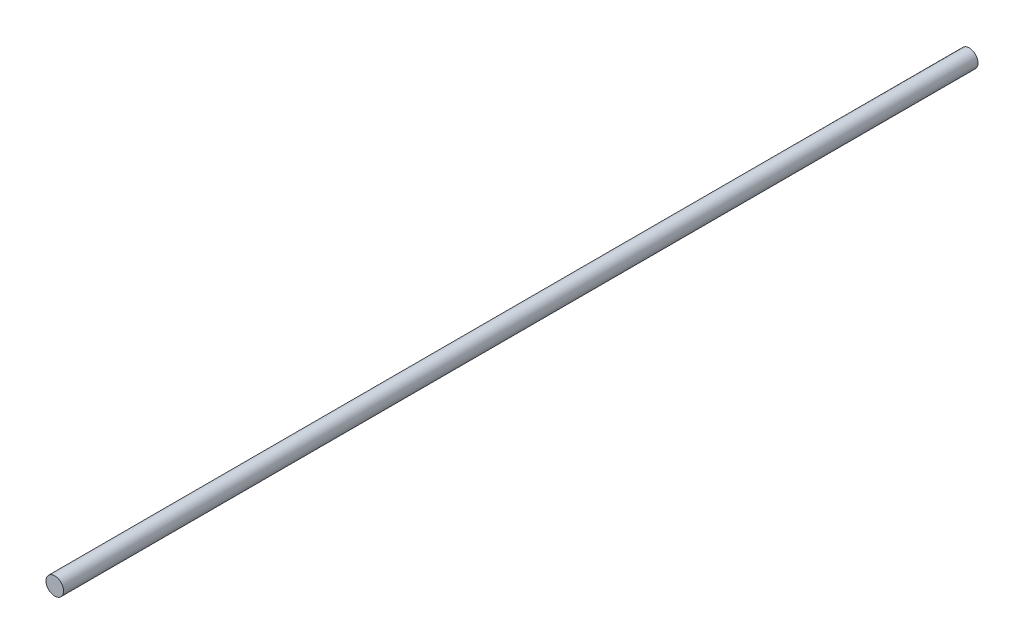
ISO-10303-21;
HEADER;
FILE_DESCRIPTION(('STEP AP214'),'2;1');
FILE_NAME('part.step','',(''),(''),'','','');
FILE_SCHEMA(('AUTOMOTIVE_DESIGN { 1 0 10303 214 1 1 1 1 }'));
ENDSEC;
DATA;
#1=APPLICATION_CONTEXT('core data for automotive mechanical design processes');
#2=APPLICATION_PROTOCOL_DEFINITION('international standard','automotive_design',2000,#1);
#3=PRODUCT_CONTEXT('',#1,'mechanical');
#4=PRODUCT('Part','Part','',(#3));
#5=PRODUCT_RELATED_PRODUCT_CATEGORY('part','',(#4));
#6=PRODUCT_DEFINITION_FORMATION('','',#4);
#7=PRODUCT_DEFINITION_CONTEXT('part definition',#1,'design');
#8=PRODUCT_DEFINITION('design','',#6,#7);
#9=PRODUCT_DEFINITION_SHAPE('','',#8);
#10=(LENGTH_UNIT() NAMED_UNIT(*) SI_UNIT(.MILLI.,.METRE.));
#11=(NAMED_UNIT(*) PLANE_ANGLE_UNIT() SI_UNIT($,.RADIAN.));
#12=(NAMED_UNIT(*) SI_UNIT($,.STERADIAN.) SOLID_ANGLE_UNIT());
#13=UNCERTAINTY_MEASURE_WITH_UNIT(LENGTH_MEASURE(1.E-05),#10,'distance_accuracy_value','');
#14=(GEOMETRIC_REPRESENTATION_CONTEXT(3) GLOBAL_UNCERTAINTY_ASSIGNED_CONTEXT((#13)) GLOBAL_UNIT_ASSIGNED_CONTEXT((#10,
#11,#12)) REPRESENTATION_CONTEXT('',''));
#15=CARTESIAN_POINT('',(0.,0.,0.));
#16=DIRECTION('',(0.,0.,1.));
#17=DIRECTION('',(1.,0.,0.));
#18=AXIS2_PLACEMENT_3D('',#15,#16,#17);
#19=CARTESIAN_POINT('',(0.,0.,330.2));
#20=DIRECTION('',(0.,0.,-1.));
#21=DIRECTION('',(-1.,0.,0.));
#22=AXIS2_PLACEMENT_3D('',#19,#20,#21);
#23=CYLINDRICAL_SURFACE('',#22,6.35);
#24=CARTESIAN_POINT('',(0.,0.,330.2));
#25=DIRECTION('',(0.,0.,1.));
#26=DIRECTION('',(1.,0.,0.));
#27=AXIS2_PLACEMENT_3D('',#24,#25,#26);
#28=CIRCLE('',#27,6.35);
#29=CARTESIAN_POINT('',(6.35,0.,330.2));
#30=VERTEX_POINT('',#29);
#31=EDGE_CURVE('E10',#30,#30,#28,.T.);
#32=ORIENTED_EDGE('',*,*,#31,.F.);
#33=EDGE_LOOP('',(#32));
#34=FACE_BOUND('',#33,.T.);
#35=CARTESIAN_POINT('',(0.,0.,-330.2));
#36=DIRECTION('',(0.,0.,1.));
#37=DIRECTION('',(1.,0.,0.));
#38=AXIS2_PLACEMENT_3D('',#35,#36,#37);
#39=CIRCLE('',#38,6.35);
#40=CARTESIAN_POINT('',(6.35,0.,-330.2));
#41=VERTEX_POINT('',#40);
#42=EDGE_CURVE('E40',#41,#41,#39,.T.);
#43=ORIENTED_EDGE('',*,*,#42,.T.);
#44=EDGE_LOOP('',(#43));
#45=FACE_BOUND('',#44,.T.);
#46=ADVANCED_FACE('F37',(#34,#45),#23,.T.);
#47=CARTESIAN_POINT('',(0.,0.,330.2));
#48=DIRECTION('',(0.,0.,1.));
#49=DIRECTION('',(1.,0.,0.));
#50=AXIS2_PLACEMENT_3D('',#47,#48,#49);
#51=PLANE('',#50);
#52=ORIENTED_EDGE('',*,*,#31,.T.);
#53=EDGE_LOOP('',(#52));
#54=FACE_BOUND('',#53,.T.);
#55=ADVANCED_FACE('F54',(#54),#51,.T.);
#56=CARTESIAN_POINT('',(0.,0.,-330.2));
#57=DIRECTION('',(0.,0.,1.));
#58=DIRECTION('',(1.,0.,0.));
#59=AXIS2_PLACEMENT_3D('',#56,#57,#58);
#60=PLANE('',#59);
#61=ORIENTED_EDGE('',*,*,#42,.F.);
#62=EDGE_LOOP('',(#61));
#63=FACE_BOUND('',#62,.T.);
#64=ADVANCED_FACE('F52',(#63),#60,.F.);
#65=CLOSED_SHELL('',(#46,#55,#64));
#66=MANIFOLD_SOLID_BREP('B2',#65);
#67=ADVANCED_BREP_SHAPE_REPRESENTATION('',(#18,#66),#14);
#68=SHAPE_DEFINITION_REPRESENTATION(#9,#67);
ENDSEC;
END-ISO-10303-21;
